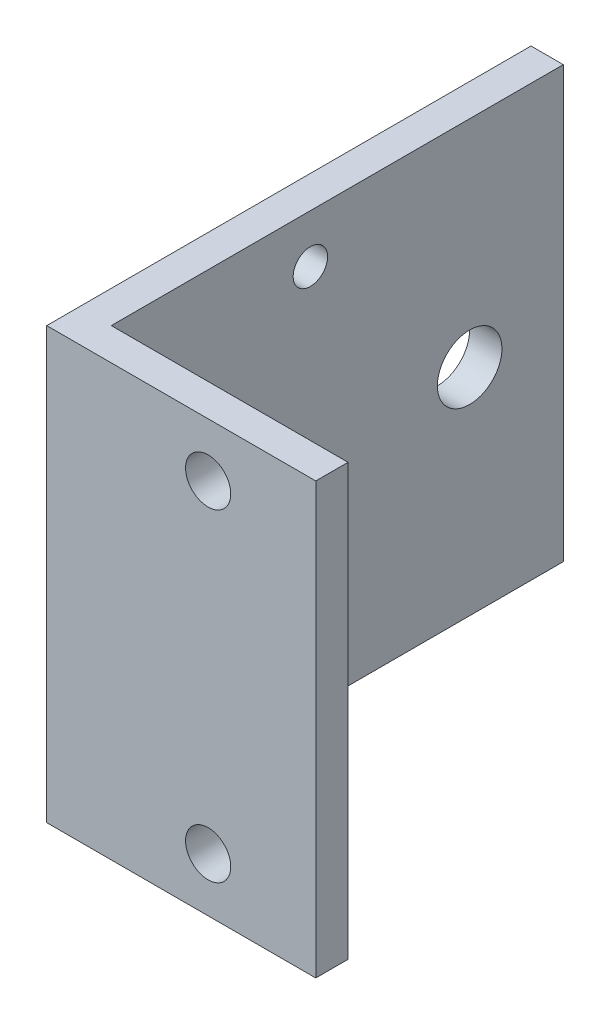
ISO-10303-21;
HEADER;
FILE_DESCRIPTION(('STEP AP214'),'2;1');
FILE_NAME('part.step','',(''),(''),'','','');
FILE_SCHEMA(('AUTOMOTIVE_DESIGN { 1 0 10303 214 1 1 1 1 }'));
ENDSEC;
DATA;
#1=APPLICATION_CONTEXT('core data for automotive mechanical design processes');
#2=APPLICATION_PROTOCOL_DEFINITION('international standard','automotive_design',2000,#1);
#3=PRODUCT_CONTEXT('',#1,'mechanical');
#4=PRODUCT('Part','Part','',(#3));
#5=PRODUCT_RELATED_PRODUCT_CATEGORY('part','',(#4));
#6=PRODUCT_DEFINITION_FORMATION('','',#4);
#7=PRODUCT_DEFINITION_CONTEXT('part definition',#1,'design');
#8=PRODUCT_DEFINITION('design','',#6,#7);
#9=PRODUCT_DEFINITION_SHAPE('','',#8);
#10=(LENGTH_UNIT() NAMED_UNIT(*) SI_UNIT(.MILLI.,.METRE.));
#11=(NAMED_UNIT(*) PLANE_ANGLE_UNIT() SI_UNIT($,.RADIAN.));
#12=(NAMED_UNIT(*) SI_UNIT($,.STERADIAN.) SOLID_ANGLE_UNIT());
#13=UNCERTAINTY_MEASURE_WITH_UNIT(LENGTH_MEASURE(1.E-05),#10,'distance_accuracy_value','');
#14=(GEOMETRIC_REPRESENTATION_CONTEXT(3) GLOBAL_UNCERTAINTY_ASSIGNED_CONTEXT((#13)) GLOBAL_UNIT_ASSIGNED_CONTEXT((#10,
#11,#12)) REPRESENTATION_CONTEXT('',''));
#15=CARTESIAN_POINT('',(0.,0.,0.));
#16=DIRECTION('',(0.,0.,1.));
#17=DIRECTION('',(1.,0.,0.));
#18=AXIS2_PLACEMENT_3D('',#15,#16,#17);
#19=CARTESIAN_POINT('',(-38.0000000000003,180.,-4.99999999999999));
#20=DIRECTION('',(0.,0.,1.));
#21=DIRECTION('',(1.,0.,0.));
#22=AXIS2_PLACEMENT_3D('',#19,#20,#21);
#23=PLANE('',#22);
#24=CARTESIAN_POINT('',(-48.0000000000002,215.,-4.99999999999985));
#25=DIRECTION('',(0.,0.,-1.));
#26=DIRECTION('',(0.,1.,0.));
#27=AXIS2_PLACEMENT_3D('',#24,#25,#26);
#28=CIRCLE('',#27,2.09999999999998);
#29=CARTESIAN_POINT('',(-48.0000000000002,217.1,-4.99999999999985));
#30=VERTEX_POINT('',#29);
#31=EDGE_CURVE('E132',#30,#30,#28,.T.);
#32=ORIENTED_EDGE('',*,*,#31,.T.);
#33=EDGE_LOOP('',(#32));
#34=FACE_BOUND('',#33,.T.);
#35=CARTESIAN_POINT('',(-48.0000000000002,185.,-4.99999999999985));
#36=DIRECTION('',(0.,0.,-1.));
#37=DIRECTION('',(0.,1.,0.));
#38=AXIS2_PLACEMENT_3D('',#35,#36,#37);
#39=CIRCLE('',#38,2.09999999999998);
#40=CARTESIAN_POINT('',(-48.0000000000002,187.1,-4.99999999999985));
#41=VERTEX_POINT('',#40);
#42=EDGE_CURVE('E138',#41,#41,#39,.T.);
#43=ORIENTED_EDGE('',*,*,#42,.T.);
#44=EDGE_LOOP('',(#43));
#45=FACE_BOUND('',#44,.T.);
#46=DIRECTION('',(0.,1.,0.));
#47=VECTOR('',#46,1.);
#48=CARTESIAN_POINT('',(-63.0000000000003,180.,-4.99999999999999));
#49=LINE('',#48,#47);
#50=CARTESIAN_POINT('',(-63.0000000000003,180.,-4.99999999999999));
#51=VERTEX_POINT('',#50);
#52=CARTESIAN_POINT('',(-63.0000000000002,220.,-4.99999999999999));
#53=VERTEX_POINT('',#52);
#54=EDGE_CURVE('E82',#51,#53,#49,.T.);
#55=ORIENTED_EDGE('',*,*,#54,.F.);
#56=DIRECTION('',(-1.,0.,0.));
#57=VECTOR('',#56,1.);
#58=CARTESIAN_POINT('',(-38.0000000000003,180.,-4.99999999999999));
#59=LINE('',#58,#57);
#60=CARTESIAN_POINT('',(-38.0000000000003,180.,-4.99999999999999));
#61=VERTEX_POINT('',#60);
#62=EDGE_CURVE('E11',#61,#51,#59,.T.);
#63=ORIENTED_EDGE('',*,*,#62,.F.);
#64=DIRECTION('',(0.,1.,0.));
#65=VECTOR('',#64,1.);
#66=CARTESIAN_POINT('',(-38.0000000000003,180.,-4.99999999999999));
#67=LINE('',#66,#65);
#68=CARTESIAN_POINT('',(-38.0000000000002,220.,-4.99999999999999));
#69=VERTEX_POINT('',#68);
#70=EDGE_CURVE('E94',#61,#69,#67,.T.);
#71=ORIENTED_EDGE('',*,*,#70,.T.);
#72=DIRECTION('',(-1.,0.,0.));
#73=VECTOR('',#72,1.);
#74=CARTESIAN_POINT('',(-38.0000000000002,220.,-4.99999999999999));
#75=LINE('',#74,#73);
#76=EDGE_CURVE('E83',#69,#53,#75,.T.);
#77=ORIENTED_EDGE('',*,*,#76,.T.);
#78=EDGE_LOOP('',(#55,#63,#71,#77));
#79=FACE_BOUND('',#78,.T.);
#80=ADVANCED_FACE('F32',(#34,#45,#79),#23,.T.);
#81=CARTESIAN_POINT('',(-38.0000000000003,180.,-50.));
#82=DIRECTION('',(0.,-1.,0.));
#83=DIRECTION('',(1.,0.,0.));
#84=AXIS2_PLACEMENT_3D('',#81,#82,#83);
#85=PLANE('',#84);
#86=DIRECTION('',(1.,0.,0.));
#87=VECTOR('',#86,1.);
#88=CARTESIAN_POINT('',(-60.0000000000003,180.,-7.99999999999985));
#89=LINE('',#88,#87);
#90=CARTESIAN_POINT('',(-60.0000000000003,180.,-7.99999999999985));
#91=VERTEX_POINT('',#90);
#92=CARTESIAN_POINT('',(-38.0000000000004,180.,-7.99999999999985));
#93=VERTEX_POINT('',#92);
#94=EDGE_CURVE('E146',#91,#93,#89,.T.);
#95=ORIENTED_EDGE('',*,*,#94,.T.);
#96=DIRECTION('',(0.,0.,1.));
#97=VECTOR('',#96,1.);
#98=CARTESIAN_POINT('',(-38.0000000000003,180.,-50.));
#99=LINE('',#98,#97);
#100=EDGE_CURVE('E56',#93,#61,#99,.T.);
#101=ORIENTED_EDGE('',*,*,#100,.T.);
#102=ORIENTED_EDGE('',*,*,#62,.T.);
#103=DIRECTION('',(0.,0.,1.));
#104=VECTOR('',#103,1.);
#105=CARTESIAN_POINT('',(-63.0000000000003,180.,-50.));
#106=LINE('',#105,#104);
#107=CARTESIAN_POINT('',(-63.0000000000003,180.,-50.));
#108=VERTEX_POINT('',#107);
#109=EDGE_CURVE('E77',#108,#51,#106,.T.);
#110=ORIENTED_EDGE('',*,*,#109,.F.);
#111=DIRECTION('',(-1.,0.,0.));
#112=VECTOR('',#111,1.);
#113=CARTESIAN_POINT('',(-38.0000000000003,180.,-50.));
#114=LINE('',#113,#112);
#115=CARTESIAN_POINT('',(-60.0000000000003,180.,-50.));
#116=VERTEX_POINT('',#115);
#117=EDGE_CURVE('E40',#116,#108,#114,.T.);
#118=ORIENTED_EDGE('',*,*,#117,.F.);
#119=DIRECTION('',(0.,0.,1.));
#120=VECTOR('',#119,1.);
#121=CARTESIAN_POINT('',(-60.0000000000003,180.,-57.9999999999999));
#122=LINE('',#121,#120);
#123=EDGE_CURVE('E143',#116,#91,#122,.T.);
#124=ORIENTED_EDGE('',*,*,#123,.T.);
#125=EDGE_LOOP('',(#95,#101,#102,#110,#118,#124));
#126=FACE_BOUND('',#125,.T.);
#127=ADVANCED_FACE('F74',(#126),#85,.T.);
#128=CARTESIAN_POINT('',(-38.0000000000002,220.,-50.));
#129=DIRECTION('',(0.,0.,-1.));
#130=DIRECTION('',(-1.,0.,0.));
#131=AXIS2_PLACEMENT_3D('',#128,#129,#130);
#132=PLANE('',#131);
#133=DIRECTION('',(0.,1.,0.));
#134=VECTOR('',#133,1.);
#135=CARTESIAN_POINT('',(-60.0000000000002,220.,-50.));
#136=LINE('',#135,#134);
#137=CARTESIAN_POINT('',(-60.0000000000002,220.,-50.));
#138=VERTEX_POINT('',#137);
#139=EDGE_CURVE('E88',#116,#138,#136,.T.);
#140=ORIENTED_EDGE('',*,*,#139,.F.);
#141=ORIENTED_EDGE('',*,*,#117,.T.);
#142=DIRECTION('',(0.,-1.,0.));
#143=VECTOR('',#142,1.);
#144=CARTESIAN_POINT('',(-63.0000000000002,220.,-50.));
#145=LINE('',#144,#143);
#146=CARTESIAN_POINT('',(-63.0000000000002,220.,-50.));
#147=VERTEX_POINT('',#146);
#148=EDGE_CURVE('E93',#147,#108,#145,.T.);
#149=ORIENTED_EDGE('',*,*,#148,.F.);
#150=DIRECTION('',(-1.,0.,0.));
#151=VECTOR('',#150,1.);
#152=CARTESIAN_POINT('',(-38.0000000000002,220.,-50.));
#153=LINE('',#152,#151);
#154=EDGE_CURVE('E102',#138,#147,#153,.T.);
#155=ORIENTED_EDGE('',*,*,#154,.F.);
#156=EDGE_LOOP('',(#140,#141,#149,#155));
#157=FACE_BOUND('',#156,.T.);
#158=ADVANCED_FACE('F167',(#157),#132,.T.);
#159=CARTESIAN_POINT('',(-38.0000000000002,220.,-4.99999999999999));
#160=DIRECTION('',(0.,1.,0.));
#161=DIRECTION('',(-1.,0.,0.));
#162=AXIS2_PLACEMENT_3D('',#159,#160,#161);
#163=PLANE('',#162);
#164=DIRECTION('',(1.,0.,0.));
#165=VECTOR('',#164,1.);
#166=CARTESIAN_POINT('',(-60.0000000000002,220.,-7.99999999999985));
#167=LINE('',#166,#165);
#168=CARTESIAN_POINT('',(-60.0000000000002,220.,-7.99999999999985));
#169=VERTEX_POINT('',#168);
#170=CARTESIAN_POINT('',(-38.0000000000002,220.,-7.99999999999985));
#171=VERTEX_POINT('',#170);
#172=EDGE_CURVE('E48',#169,#171,#167,.T.);
#173=ORIENTED_EDGE('',*,*,#172,.F.);
#174=DIRECTION('',(0.,0.,1.));
#175=VECTOR('',#174,1.);
#176=CARTESIAN_POINT('',(-60.0000000000002,220.,-57.9999999999999));
#177=LINE('',#176,#175);
#178=EDGE_CURVE('E107',#138,#169,#177,.T.);
#179=ORIENTED_EDGE('',*,*,#178,.F.);
#180=ORIENTED_EDGE('',*,*,#154,.T.);
#181=DIRECTION('',(0.,0.,-1.));
#182=VECTOR('',#181,1.);
#183=CARTESIAN_POINT('',(-63.0000000000002,220.,-4.99999999999999));
#184=LINE('',#183,#182);
#185=EDGE_CURVE('E87',#53,#147,#184,.T.);
#186=ORIENTED_EDGE('',*,*,#185,.F.);
#187=ORIENTED_EDGE('',*,*,#76,.F.);
#188=DIRECTION('',(0.,0.,-1.));
#189=VECTOR('',#188,1.);
#190=CARTESIAN_POINT('',(-38.0000000000002,220.,-4.99999999999999));
#191=LINE('',#190,#189);
#192=EDGE_CURVE('E96',#69,#171,#191,.T.);
#193=ORIENTED_EDGE('',*,*,#192,.T.);
#194=EDGE_LOOP('',(#173,#179,#180,#186,#187,#193));
#195=FACE_BOUND('',#194,.T.);
#196=ADVANCED_FACE('F160',(#195),#163,.T.);
#197=CARTESIAN_POINT('',(-38.0000000000007,0.,0.));
#198=DIRECTION('',(-1.,0.,0.));
#199=DIRECTION('',(0.,-1.,0.));
#200=AXIS2_PLACEMENT_3D('',#197,#198,#199);
#201=PLANE('',#200);
#202=ORIENTED_EDGE('',*,*,#100,.F.);
#203=DIRECTION('',(0.,1.,0.));
#204=VECTOR('',#203,1.);
#205=CARTESIAN_POINT('',(-38.0000000000004,180.,-7.99999999999985));
#206=LINE('',#205,#204);
#207=EDGE_CURVE('E152',#93,#171,#206,.T.);
#208=ORIENTED_EDGE('',*,*,#207,.T.);
#209=ORIENTED_EDGE('',*,*,#192,.F.);
#210=ORIENTED_EDGE('',*,*,#70,.F.);
#211=EDGE_LOOP('',(#202,#208,#209,#210));
#212=FACE_BOUND('',#211,.T.);
#213=ADVANCED_FACE('F182',(#212),#201,.F.);
#214=CARTESIAN_POINT('',(-63.0000000000007,1.53002610581156E-13,0.));
#215=DIRECTION('',(-1.,0.,0.));
#216=DIRECTION('',(0.,-1.,0.));
#217=AXIS2_PLACEMENT_3D('',#214,#215,#216);
#218=PLANE('',#217);
#219=CARTESIAN_POINT('',(-63.0000000000002,215.5,-26.5));
#220=DIRECTION('',(-1.,0.,0.));
#221=DIRECTION('',(0.,0.,1.));
#222=AXIS2_PLACEMENT_3D('',#219,#220,#221);
#223=CIRCLE('',#222,1.59999999999999);
#224=CARTESIAN_POINT('',(-63.0000000000002,215.5,-24.9));
#225=VERTEX_POINT('',#224);
#226=EDGE_CURVE('E244',#225,#225,#223,.T.);
#227=ORIENTED_EDGE('',*,*,#226,.F.);
#228=EDGE_LOOP('',(#227));
#229=FACE_BOUND('',#228,.T.);
#230=CARTESIAN_POINT('',(-63.0000000000003,184.5,-26.5));
#231=DIRECTION('',(-1.,0.,0.));
#232=DIRECTION('',(0.,0.,1.));
#233=AXIS2_PLACEMENT_3D('',#230,#231,#232);
#234=CIRCLE('',#233,1.59999999999999);
#235=CARTESIAN_POINT('',(-63.0000000000003,184.5,-24.9));
#236=VERTEX_POINT('',#235);
#237=EDGE_CURVE('E123',#236,#236,#234,.T.);
#238=ORIENTED_EDGE('',*,*,#237,.F.);
#239=EDGE_LOOP('',(#238));
#240=FACE_BOUND('',#239,.T.);
#241=CARTESIAN_POINT('',(-63.0000000000002,207.75,-13.0766062413412));
#242=DIRECTION('',(-1.,0.,0.));
#243=DIRECTION('',(0.,0.,1.));
#244=AXIS2_PLACEMENT_3D('',#241,#242,#243);
#245=CIRCLE('',#244,1.59999999999999);
#246=CARTESIAN_POINT('',(-63.0000000000002,207.75,-11.4766062413412));
#247=VERTEX_POINT('',#246);
#248=EDGE_CURVE('E112',#247,#247,#245,.T.);
#249=ORIENTED_EDGE('',*,*,#248,.F.);
#250=EDGE_LOOP('',(#249));
#251=FACE_BOUND('',#250,.T.);
#252=CARTESIAN_POINT('',(-63.0000000000003,192.25,-13.0766062413412));
#253=DIRECTION('',(-1.,0.,0.));
#254=DIRECTION('',(0.,0.,1.));
#255=AXIS2_PLACEMENT_3D('',#252,#253,#254);
#256=CIRCLE('',#255,1.59999999999999);
#257=CARTESIAN_POINT('',(-63.0000000000003,192.25,-11.4766062413412));
#258=VERTEX_POINT('',#257);
#259=EDGE_CURVE('E111',#258,#258,#256,.T.);
#260=ORIENTED_EDGE('',*,*,#259,.F.);
#261=EDGE_LOOP('',(#260));
#262=FACE_BOUND('',#261,.T.);
#263=CARTESIAN_POINT('',(-63.0000000000003,200.,-41.3));
#264=DIRECTION('',(-1.,0.,0.));
#265=DIRECTION('',(0.,-1.,0.));
#266=AXIS2_PLACEMENT_3D('',#263,#264,#265);
#267=CIRCLE('',#266,3.);
#268=CARTESIAN_POINT('',(-63.0000000000003,197.,-41.3));
#269=VERTEX_POINT('',#268);
#270=EDGE_CURVE('E108',#269,#269,#267,.T.);
#271=ORIENTED_EDGE('',*,*,#270,.F.);
#272=EDGE_LOOP('',(#271));
#273=FACE_BOUND('',#272,.T.);
#274=ORIENTED_EDGE('',*,*,#54,.T.);
#275=ORIENTED_EDGE('',*,*,#185,.T.);
#276=ORIENTED_EDGE('',*,*,#148,.T.);
#277=ORIENTED_EDGE('',*,*,#109,.T.);
#278=EDGE_LOOP('',(#274,#275,#276,#277));
#279=FACE_BOUND('',#278,.T.);
#280=ADVANCED_FACE('F91',(#229,#240,#251,#262,#273,#279),#218,.T.);
#281=CARTESIAN_POINT('',(-60.0000000000003,180.,-7.99999999999985));
#282=DIRECTION('',(0.,0.,1.));
#283=DIRECTION('',(1.,0.,0.));
#284=AXIS2_PLACEMENT_3D('',#281,#282,#283);
#285=PLANE('',#284);
#286=CARTESIAN_POINT('',(-48.0000000000002,215.,-7.99999999999986));
#287=DIRECTION('',(0.,0.,-1.));
#288=DIRECTION('',(0.,1.,0.));
#289=AXIS2_PLACEMENT_3D('',#286,#287,#288);
#290=CIRCLE('',#289,2.09999999999998);
#291=CARTESIAN_POINT('',(-48.0000000000002,217.1,-7.99999999999986));
#292=VERTEX_POINT('',#291);
#293=EDGE_CURVE('E129',#292,#292,#290,.T.);
#294=ORIENTED_EDGE('',*,*,#293,.F.);
#295=EDGE_LOOP('',(#294));
#296=FACE_BOUND('',#295,.T.);
#297=CARTESIAN_POINT('',(-48.0000000000002,185.,-7.99999999999986));
#298=DIRECTION('',(0.,0.,-1.));
#299=DIRECTION('',(0.,1.,0.));
#300=AXIS2_PLACEMENT_3D('',#297,#298,#299);
#301=CIRCLE('',#300,2.09999999999998);
#302=CARTESIAN_POINT('',(-48.0000000000002,187.1,-7.99999999999986));
#303=VERTEX_POINT('',#302);
#304=EDGE_CURVE('E135',#303,#303,#301,.T.);
#305=ORIENTED_EDGE('',*,*,#304,.F.);
#306=EDGE_LOOP('',(#305));
#307=FACE_BOUND('',#306,.T.);
#308=ORIENTED_EDGE('',*,*,#172,.T.);
#309=ORIENTED_EDGE('',*,*,#207,.F.);
#310=ORIENTED_EDGE('',*,*,#94,.F.);
#311=DIRECTION('',(0.,1.,0.));
#312=VECTOR('',#311,1.);
#313=CARTESIAN_POINT('',(-60.0000000000003,180.,-7.99999999999985));
#314=LINE('',#313,#312);
#315=EDGE_CURVE('E148',#91,#169,#314,.T.);
#316=ORIENTED_EDGE('',*,*,#315,.T.);
#317=EDGE_LOOP('',(#308,#309,#310,#316));
#318=FACE_BOUND('',#317,.T.);
#319=ADVANCED_FACE('F180',(#296,#307,#318),#285,.F.);
#320=CARTESIAN_POINT('',(-60.0000000000003,180.,-57.9999999999999));
#321=DIRECTION('',(-1.,0.,0.));
#322=DIRECTION('',(0.,-1.,0.));
#323=AXIS2_PLACEMENT_3D('',#320,#321,#322);
#324=PLANE('',#323);
#325=CARTESIAN_POINT('',(-60.0000000000002,215.5,-26.5));
#326=DIRECTION('',(-1.,0.,0.));
#327=DIRECTION('',(0.,-1.,0.));
#328=AXIS2_PLACEMENT_3D('',#325,#326,#327);
#329=CIRCLE('',#328,1.59999999999998);
#330=CARTESIAN_POINT('',(-60.0000000000002,213.9,-26.5));
#331=VERTEX_POINT('',#330);
#332=EDGE_CURVE('E247',#331,#331,#329,.T.);
#333=ORIENTED_EDGE('',*,*,#332,.T.);
#334=EDGE_LOOP('',(#333));
#335=FACE_BOUND('',#334,.T.);
#336=CARTESIAN_POINT('',(-60.0000000000003,184.5,-26.5));
#337=DIRECTION('',(-1.,0.,0.));
#338=DIRECTION('',(0.,-1.,0.));
#339=AXIS2_PLACEMENT_3D('',#336,#337,#338);
#340=CIRCLE('',#339,1.59999999999998);
#341=CARTESIAN_POINT('',(-60.0000000000003,182.9,-26.5));
#342=VERTEX_POINT('',#341);
#343=EDGE_CURVE('E35',#342,#342,#340,.T.);
#344=ORIENTED_EDGE('',*,*,#343,.T.);
#345=EDGE_LOOP('',(#344));
#346=FACE_BOUND('',#345,.T.);
#347=CARTESIAN_POINT('',(-60.0000000000002,207.75,-13.0766062413412));
#348=DIRECTION('',(-1.,0.,0.));
#349=DIRECTION('',(0.,-1.,0.));
#350=AXIS2_PLACEMENT_3D('',#347,#348,#349);
#351=CIRCLE('',#350,1.59999999999998);
#352=CARTESIAN_POINT('',(-60.0000000000002,206.15,-13.0766062413412));
#353=VERTEX_POINT('',#352);
#354=EDGE_CURVE('E109',#353,#353,#351,.T.);
#355=ORIENTED_EDGE('',*,*,#354,.T.);
#356=EDGE_LOOP('',(#355));
#357=FACE_BOUND('',#356,.T.);
#358=CARTESIAN_POINT('',(-60.0000000000003,192.25,-13.0766062413412));
#359=DIRECTION('',(-1.,0.,0.));
#360=DIRECTION('',(0.,-1.,0.));
#361=AXIS2_PLACEMENT_3D('',#358,#359,#360);
#362=CIRCLE('',#361,1.59999999999998);
#363=CARTESIAN_POINT('',(-60.0000000000003,190.65,-13.0766062413412));
#364=VERTEX_POINT('',#363);
#365=EDGE_CURVE('E116',#364,#364,#362,.T.);
#366=ORIENTED_EDGE('',*,*,#365,.T.);
#367=EDGE_LOOP('',(#366));
#368=FACE_BOUND('',#367,.T.);
#369=CARTESIAN_POINT('',(-60.0000000000003,200.,-41.3));
#370=DIRECTION('',(-1.,0.,0.));
#371=DIRECTION('',(0.,-1.,0.));
#372=AXIS2_PLACEMENT_3D('',#369,#370,#371);
#373=CIRCLE('',#372,3.);
#374=CARTESIAN_POINT('',(-60.0000000000003,197.,-41.3));
#375=VERTEX_POINT('',#374);
#376=EDGE_CURVE('E105',#375,#375,#373,.T.);
#377=ORIENTED_EDGE('',*,*,#376,.T.);
#378=EDGE_LOOP('',(#377));
#379=FACE_BOUND('',#378,.T.);
#380=ORIENTED_EDGE('',*,*,#139,.T.);
#381=ORIENTED_EDGE('',*,*,#178,.T.);
#382=ORIENTED_EDGE('',*,*,#315,.F.);
#383=ORIENTED_EDGE('',*,*,#123,.F.);
#384=EDGE_LOOP('',(#380,#381,#382,#383));
#385=FACE_BOUND('',#384,.T.);
#386=ADVANCED_FACE('F179',(#335,#346,#357,#368,#379,#385),#324,.F.);
#387=CARTESIAN_POINT('',(-38.0000000000001,200.,-41.3));
#388=DIRECTION('',(-1.,0.,0.));
#389=DIRECTION('',(0.,-1.,0.));
#390=AXIS2_PLACEMENT_3D('',#387,#388,#389);
#391=CYLINDRICAL_SURFACE('',#390,3.);
#392=ORIENTED_EDGE('',*,*,#270,.T.);
#393=EDGE_LOOP('',(#392));
#394=FACE_BOUND('',#393,.T.);
#395=ORIENTED_EDGE('',*,*,#376,.F.);
#396=EDGE_LOOP('',(#395));
#397=FACE_BOUND('',#396,.T.);
#398=ADVANCED_FACE('F206',(#394,#397),#391,.F.);
#399=CARTESIAN_POINT('',(-48.0000000000002,185.,-7.99999999999985));
#400=DIRECTION('',(0.,0.,-1.));
#401=DIRECTION('',(0.,1.,0.));
#402=AXIS2_PLACEMENT_3D('',#399,#400,#401);
#403=CYLINDRICAL_SURFACE('',#402,2.09999999999998);
#404=ORIENTED_EDGE('',*,*,#42,.F.);
#405=EDGE_LOOP('',(#404));
#406=FACE_BOUND('',#405,.T.);
#407=ORIENTED_EDGE('',*,*,#304,.T.);
#408=EDGE_LOOP('',(#407));
#409=FACE_BOUND('',#408,.T.);
#410=ADVANCED_FACE('F202',(#406,#409),#403,.F.);
#411=CARTESIAN_POINT('',(-48.0000000000002,215.,-7.99999999999985));
#412=DIRECTION('',(0.,0.,-1.));
#413=DIRECTION('',(0.,1.,0.));
#414=AXIS2_PLACEMENT_3D('',#411,#412,#413);
#415=CYLINDRICAL_SURFACE('',#414,2.09999999999998);
#416=ORIENTED_EDGE('',*,*,#31,.F.);
#417=EDGE_LOOP('',(#416));
#418=FACE_BOUND('',#417,.T.);
#419=ORIENTED_EDGE('',*,*,#293,.T.);
#420=EDGE_LOOP('',(#419));
#421=FACE_BOUND('',#420,.T.);
#422=ADVANCED_FACE('F205',(#418,#421),#415,.F.);
#423=CARTESIAN_POINT('',(-63.0000000000003,192.25,-13.0766062413412));
#424=DIRECTION('',(-1.,0.,0.));
#425=DIRECTION('',(0.,0.,1.));
#426=AXIS2_PLACEMENT_3D('',#423,#424,#425);
#427=CYLINDRICAL_SURFACE('',#426,1.59999999999998);
#428=ORIENTED_EDGE('',*,*,#259,.T.);
#429=EDGE_LOOP('',(#428));
#430=FACE_BOUND('',#429,.T.);
#431=ORIENTED_EDGE('',*,*,#365,.F.);
#432=EDGE_LOOP('',(#431));
#433=FACE_BOUND('',#432,.T.);
#434=ADVANCED_FACE('F224',(#430,#433),#427,.F.);
#435=CARTESIAN_POINT('',(-63.0000000000002,207.75,-13.0766062413412));
#436=DIRECTION('',(-1.,0.,0.));
#437=DIRECTION('',(0.,0.,1.));
#438=AXIS2_PLACEMENT_3D('',#435,#436,#437);
#439=CYLINDRICAL_SURFACE('',#438,1.59999999999998);
#440=ORIENTED_EDGE('',*,*,#248,.T.);
#441=EDGE_LOOP('',(#440));
#442=FACE_BOUND('',#441,.T.);
#443=ORIENTED_EDGE('',*,*,#354,.F.);
#444=EDGE_LOOP('',(#443));
#445=FACE_BOUND('',#444,.T.);
#446=ADVANCED_FACE('F228',(#442,#445),#439,.F.);
#447=CARTESIAN_POINT('',(-63.0000000000003,184.5,-26.5));
#448=DIRECTION('',(-1.,0.,0.));
#449=DIRECTION('',(0.,0.,1.));
#450=AXIS2_PLACEMENT_3D('',#447,#448,#449);
#451=CYLINDRICAL_SURFACE('',#450,1.59999999999998);
#452=ORIENTED_EDGE('',*,*,#237,.T.);
#453=EDGE_LOOP('',(#452));
#454=FACE_BOUND('',#453,.T.);
#455=ORIENTED_EDGE('',*,*,#343,.F.);
#456=EDGE_LOOP('',(#455));
#457=FACE_BOUND('',#456,.T.);
#458=ADVANCED_FACE('F232',(#454,#457),#451,.F.);
#459=CARTESIAN_POINT('',(-63.0000000000002,215.5,-26.5));
#460=DIRECTION('',(-1.,0.,0.));
#461=DIRECTION('',(0.,0.,1.));
#462=AXIS2_PLACEMENT_3D('',#459,#460,#461);
#463=CYLINDRICAL_SURFACE('',#462,1.59999999999998);
#464=ORIENTED_EDGE('',*,*,#226,.T.);
#465=EDGE_LOOP('',(#464));
#466=FACE_BOUND('',#465,.T.);
#467=ORIENTED_EDGE('',*,*,#332,.F.);
#468=EDGE_LOOP('',(#467));
#469=FACE_BOUND('',#468,.T.);
#470=ADVANCED_FACE('F235',(#466,#469),#463,.F.);
#471=CLOSED_SHELL('',(#80,#127,#158,#196,#213,#280,#319,#386,#398,#410,#422,#434,#446,#458,#470));
#472=MANIFOLD_SOLID_BREP('B2',#471);
#473=ADVANCED_BREP_SHAPE_REPRESENTATION('',(#18,#472),#14);
#474=SHAPE_DEFINITION_REPRESENTATION(#9,#473);
ENDSEC;
END-ISO-10303-21;
